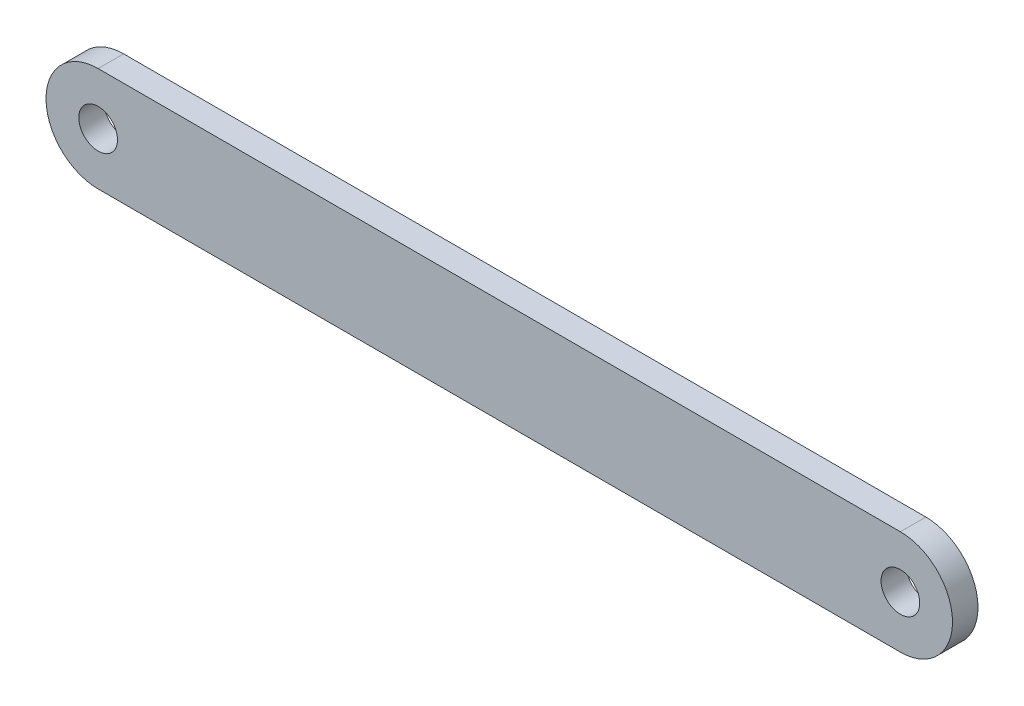
ISO-10303-21;
HEADER;
FILE_DESCRIPTION(('STEP AP214'),'2;1');
FILE_NAME('part.step','',(''),(''),'','','');
FILE_SCHEMA(('AUTOMOTIVE_DESIGN { 1 0 10303 214 1 1 1 1 }'));
ENDSEC;
DATA;
#1=APPLICATION_CONTEXT('core data for automotive mechanical design processes');
#2=APPLICATION_PROTOCOL_DEFINITION('international standard','automotive_design',2000,#1);
#3=PRODUCT_CONTEXT('',#1,'mechanical');
#4=PRODUCT('Part','Part','',(#3));
#5=PRODUCT_RELATED_PRODUCT_CATEGORY('part','',(#4));
#6=PRODUCT_DEFINITION_FORMATION('','',#4);
#7=PRODUCT_DEFINITION_CONTEXT('part definition',#1,'design');
#8=PRODUCT_DEFINITION('design','',#6,#7);
#9=PRODUCT_DEFINITION_SHAPE('','',#8);
#10=(LENGTH_UNIT() NAMED_UNIT(*) SI_UNIT(.MILLI.,.METRE.));
#11=(NAMED_UNIT(*) PLANE_ANGLE_UNIT() SI_UNIT($,.RADIAN.));
#12=(NAMED_UNIT(*) SI_UNIT($,.STERADIAN.) SOLID_ANGLE_UNIT());
#13=UNCERTAINTY_MEASURE_WITH_UNIT(LENGTH_MEASURE(1.E-05),#10,'distance_accuracy_value','');
#14=(GEOMETRIC_REPRESENTATION_CONTEXT(3) GLOBAL_UNCERTAINTY_ASSIGNED_CONTEXT((#13)) GLOBAL_UNIT_ASSIGNED_CONTEXT((#10,
#11,#12)) REPRESENTATION_CONTEXT('',''));
#15=CARTESIAN_POINT('',(0.,0.,0.));
#16=DIRECTION('',(0.,0.,1.));
#17=DIRECTION('',(1.,0.,0.));
#18=AXIS2_PLACEMENT_3D('',#15,#16,#17);
#19=CARTESIAN_POINT('',(-50.,0.,3.175));
#20=DIRECTION('',(0.,0.,1.));
#21=DIRECTION('',(1.,0.,0.));
#22=AXIS2_PLACEMENT_3D('',#19,#20,#21);
#23=PLANE('',#22);
#24=CARTESIAN_POINT('',(-50.,0.,3.175));
#25=DIRECTION('',(0.,0.,1.));
#26=DIRECTION('',(1.,0.,0.));
#27=AXIS2_PLACEMENT_3D('',#24,#25,#26);
#28=CIRCLE('',#27,2.413);
#29=CARTESIAN_POINT('',(-47.587,0.,3.175));
#30=VERTEX_POINT('',#29);
#31=EDGE_CURVE('E100',#30,#30,#28,.T.);
#32=ORIENTED_EDGE('',*,*,#31,.F.);
#33=EDGE_LOOP('',(#32));
#34=FACE_BOUND('',#33,.T.);
#35=CARTESIAN_POINT('',(-50.,0.,3.175));
#36=DIRECTION('',(0.,0.,1.));
#37=DIRECTION('',(1.,0.,0.));
#38=AXIS2_PLACEMENT_3D('',#35,#36,#37);
#39=CIRCLE('',#38,6.5);
#40=CARTESIAN_POINT('',(-50.,6.5,3.175));
#41=VERTEX_POINT('',#40);
#42=CARTESIAN_POINT('',(-50.,-6.5,3.175));
#43=VERTEX_POINT('',#42);
#44=EDGE_CURVE('E85',#41,#43,#39,.T.);
#45=ORIENTED_EDGE('',*,*,#44,.T.);
#46=DIRECTION('',(1.,0.,0.));
#47=VECTOR('',#46,1.);
#48=CARTESIAN_POINT('',(-50.,-6.5,3.175));
#49=LINE('',#48,#47);
#50=CARTESIAN_POINT('',(50.,-6.49999999999998,3.175));
#51=VERTEX_POINT('',#50);
#52=EDGE_CURVE('E80',#43,#51,#49,.T.);
#53=ORIENTED_EDGE('',*,*,#52,.T.);
#54=CARTESIAN_POINT('',(50.,0.,3.175));
#55=DIRECTION('',(0.,0.,1.));
#56=DIRECTION('',(1.,0.,0.));
#57=AXIS2_PLACEMENT_3D('',#54,#55,#56);
#58=CIRCLE('',#57,6.5);
#59=CARTESIAN_POINT('',(50.,6.50000000000002,3.175));
#60=VERTEX_POINT('',#59);
#61=EDGE_CURVE('E83',#51,#60,#58,.T.);
#62=ORIENTED_EDGE('',*,*,#61,.T.);
#63=DIRECTION('',(-1.,0.,0.));
#64=VECTOR('',#63,1.);
#65=CARTESIAN_POINT('',(-50.,6.5,3.175));
#66=LINE('',#65,#64);
#67=EDGE_CURVE('E50',#60,#41,#66,.T.);
#68=ORIENTED_EDGE('',*,*,#67,.T.);
#69=EDGE_LOOP('',(#45,#53,#62,#68));
#70=FACE_BOUND('',#69,.T.);
#71=CARTESIAN_POINT('',(50.,0.,3.175));
#72=DIRECTION('',(0.,0.,1.));
#73=DIRECTION('',(1.,0.,0.));
#74=AXIS2_PLACEMENT_3D('',#71,#72,#73);
#75=CIRCLE('',#74,2.413);
#76=CARTESIAN_POINT('',(52.413,0.,3.175));
#77=VERTEX_POINT('',#76);
#78=EDGE_CURVE('E115',#77,#77,#75,.T.);
#79=ORIENTED_EDGE('',*,*,#78,.F.);
#80=EDGE_LOOP('',(#79));
#81=FACE_BOUND('',#80,.T.);
#82=ADVANCED_FACE('F33',(#34,#70,#81),#23,.T.);
#83=CARTESIAN_POINT('',(-50.,0.,0.));
#84=DIRECTION('',(0.,0.,1.));
#85=DIRECTION('',(1.,0.,0.));
#86=AXIS2_PLACEMENT_3D('',#83,#84,#85);
#87=PLANE('',#86);
#88=CARTESIAN_POINT('',(-50.,0.,0.));
#89=DIRECTION('',(0.,0.,1.));
#90=DIRECTION('',(1.,0.,0.));
#91=AXIS2_PLACEMENT_3D('',#88,#89,#90);
#92=CIRCLE('',#91,6.5);
#93=CARTESIAN_POINT('',(-50.,6.5,0.));
#94=VERTEX_POINT('',#93);
#95=CARTESIAN_POINT('',(-50.,-6.5,0.));
#96=VERTEX_POINT('',#95);
#97=EDGE_CURVE('E97',#94,#96,#92,.T.);
#98=ORIENTED_EDGE('',*,*,#97,.F.);
#99=DIRECTION('',(-1.,0.,0.));
#100=VECTOR('',#99,1.);
#101=CARTESIAN_POINT('',(-50.,6.5,0.));
#102=LINE('',#101,#100);
#103=CARTESIAN_POINT('',(50.,6.50000000000002,0.));
#104=VERTEX_POINT('',#103);
#105=EDGE_CURVE('E73',#104,#94,#102,.T.);
#106=ORIENTED_EDGE('',*,*,#105,.F.);
#107=CARTESIAN_POINT('',(50.,0.,0.));
#108=DIRECTION('',(0.,0.,1.));
#109=DIRECTION('',(1.,0.,0.));
#110=AXIS2_PLACEMENT_3D('',#107,#108,#109);
#111=CIRCLE('',#110,6.5);
#112=CARTESIAN_POINT('',(50.,-6.49999999999998,0.));
#113=VERTEX_POINT('',#112);
#114=EDGE_CURVE('E67',#113,#104,#111,.T.);
#115=ORIENTED_EDGE('',*,*,#114,.F.);
#116=DIRECTION('',(1.,0.,0.));
#117=VECTOR('',#116,1.);
#118=CARTESIAN_POINT('',(-50.,-6.5,0.));
#119=LINE('',#118,#117);
#120=EDGE_CURVE('E89',#96,#113,#119,.T.);
#121=ORIENTED_EDGE('',*,*,#120,.F.);
#122=EDGE_LOOP('',(#98,#106,#115,#121));
#123=FACE_BOUND('',#122,.T.);
#124=CARTESIAN_POINT('',(-50.,0.,0.));
#125=DIRECTION('',(0.,0.,1.));
#126=DIRECTION('',(1.,0.,0.));
#127=AXIS2_PLACEMENT_3D('',#124,#125,#126);
#128=CIRCLE('',#127,2.413);
#129=CARTESIAN_POINT('',(-47.587,0.,0.));
#130=VERTEX_POINT('',#129);
#131=EDGE_CURVE('E112',#130,#130,#128,.T.);
#132=ORIENTED_EDGE('',*,*,#131,.T.);
#133=EDGE_LOOP('',(#132));
#134=FACE_BOUND('',#133,.T.);
#135=CARTESIAN_POINT('',(50.,0.,0.));
#136=DIRECTION('',(0.,0.,1.));
#137=DIRECTION('',(1.,0.,0.));
#138=AXIS2_PLACEMENT_3D('',#135,#136,#137);
#139=CIRCLE('',#138,2.413);
#140=CARTESIAN_POINT('',(52.413,0.,0.));
#141=VERTEX_POINT('',#140);
#142=EDGE_CURVE('E118',#141,#141,#139,.T.);
#143=ORIENTED_EDGE('',*,*,#142,.T.);
#144=EDGE_LOOP('',(#143));
#145=FACE_BOUND('',#144,.T.);
#146=ADVANCED_FACE('F108',(#123,#134,#145),#87,.F.);
#147=CARTESIAN_POINT('',(-50.,0.,3.175));
#148=DIRECTION('',(0.,0.,-1.));
#149=DIRECTION('',(-1.,0.,0.));
#150=AXIS2_PLACEMENT_3D('',#147,#148,#149);
#151=CYLINDRICAL_SURFACE('',#150,6.5);
#152=ORIENTED_EDGE('',*,*,#97,.T.);
#153=DIRECTION('',(0.,0.,-1.));
#154=VECTOR('',#153,1.);
#155=CARTESIAN_POINT('',(-50.,-6.5,3.175));
#156=LINE('',#155,#154);
#157=EDGE_CURVE('E11',#43,#96,#156,.T.);
#158=ORIENTED_EDGE('',*,*,#157,.F.);
#159=ORIENTED_EDGE('',*,*,#44,.F.);
#160=DIRECTION('',(0.,0.,-1.));
#161=VECTOR('',#160,1.);
#162=CARTESIAN_POINT('',(-50.,6.5,3.175));
#163=LINE('',#162,#161);
#164=EDGE_CURVE('E93',#41,#94,#163,.T.);
#165=ORIENTED_EDGE('',*,*,#164,.T.);
#166=EDGE_LOOP('',(#152,#158,#159,#165));
#167=FACE_BOUND('',#166,.T.);
#168=ADVANCED_FACE('F35',(#167),#151,.T.);
#169=CARTESIAN_POINT('',(-50.,-6.5,3.175));
#170=DIRECTION('',(0.,1.,0.));
#171=DIRECTION('',(-1.,0.,0.));
#172=AXIS2_PLACEMENT_3D('',#169,#170,#171);
#173=PLANE('',#172);
#174=ORIENTED_EDGE('',*,*,#120,.T.);
#175=DIRECTION('',(0.,0.,-1.));
#176=VECTOR('',#175,1.);
#177=CARTESIAN_POINT('',(50.,-6.49999999999998,3.175));
#178=LINE('',#177,#176);
#179=EDGE_CURVE('E42',#51,#113,#178,.T.);
#180=ORIENTED_EDGE('',*,*,#179,.F.);
#181=ORIENTED_EDGE('',*,*,#52,.F.);
#182=ORIENTED_EDGE('',*,*,#157,.T.);
#183=EDGE_LOOP('',(#174,#180,#181,#182));
#184=FACE_BOUND('',#183,.T.);
#185=ADVANCED_FACE('F88',(#184),#173,.F.);
#186=CARTESIAN_POINT('',(50.,0.,3.175));
#187=DIRECTION('',(0.,0.,-1.));
#188=DIRECTION('',(-1.,0.,0.));
#189=AXIS2_PLACEMENT_3D('',#186,#187,#188);
#190=CYLINDRICAL_SURFACE('',#189,6.5);
#191=ORIENTED_EDGE('',*,*,#114,.T.);
#192=DIRECTION('',(0.,0.,-1.));
#193=VECTOR('',#192,1.);
#194=CARTESIAN_POINT('',(50.,6.50000000000002,3.175));
#195=LINE('',#194,#193);
#196=EDGE_CURVE('E90',#60,#104,#195,.T.);
#197=ORIENTED_EDGE('',*,*,#196,.F.);
#198=ORIENTED_EDGE('',*,*,#61,.F.);
#199=ORIENTED_EDGE('',*,*,#179,.T.);
#200=EDGE_LOOP('',(#191,#197,#198,#199));
#201=FACE_BOUND('',#200,.T.);
#202=ADVANCED_FACE('F91',(#201),#190,.T.);
#203=CARTESIAN_POINT('',(-50.,6.5,3.175));
#204=DIRECTION('',(0.,-1.,0.));
#205=DIRECTION('',(1.,0.,0.));
#206=AXIS2_PLACEMENT_3D('',#203,#204,#205);
#207=PLANE('',#206);
#208=ORIENTED_EDGE('',*,*,#105,.T.);
#209=ORIENTED_EDGE('',*,*,#164,.F.);
#210=ORIENTED_EDGE('',*,*,#67,.F.);
#211=ORIENTED_EDGE('',*,*,#196,.T.);
#212=EDGE_LOOP('',(#208,#209,#210,#211));
#213=FACE_BOUND('',#212,.T.);
#214=ADVANCED_FACE('F105',(#213),#207,.F.);
#215=CARTESIAN_POINT('',(-50.,0.,3.175));
#216=DIRECTION('',(0.,0.,-1.));
#217=DIRECTION('',(-1.,0.,0.));
#218=AXIS2_PLACEMENT_3D('',#215,#216,#217);
#219=CYLINDRICAL_SURFACE('',#218,2.413);
#220=ORIENTED_EDGE('',*,*,#31,.T.);
#221=EDGE_LOOP('',(#220));
#222=FACE_BOUND('',#221,.T.);
#223=ORIENTED_EDGE('',*,*,#131,.F.);
#224=EDGE_LOOP('',(#223));
#225=FACE_BOUND('',#224,.T.);
#226=ADVANCED_FACE('F135',(#222,#225),#219,.F.);
#227=CARTESIAN_POINT('',(50.,0.,3.175));
#228=DIRECTION('',(0.,0.,-1.));
#229=DIRECTION('',(-1.,0.,0.));
#230=AXIS2_PLACEMENT_3D('',#227,#228,#229);
#231=CYLINDRICAL_SURFACE('',#230,2.413);
#232=ORIENTED_EDGE('',*,*,#78,.T.);
#233=EDGE_LOOP('',(#232));
#234=FACE_BOUND('',#233,.T.);
#235=ORIENTED_EDGE('',*,*,#142,.F.);
#236=EDGE_LOOP('',(#235));
#237=FACE_BOUND('',#236,.T.);
#238=ADVANCED_FACE('F124',(#234,#237),#231,.F.);
#239=CLOSED_SHELL('',(#82,#146,#168,#185,#202,#214,#226,#238));
#240=MANIFOLD_SOLID_BREP('B2',#239);
#241=ADVANCED_BREP_SHAPE_REPRESENTATION('',(#18,#240),#14);
#242=SHAPE_DEFINITION_REPRESENTATION(#9,#241);
ENDSEC;
END-ISO-10303-21;
